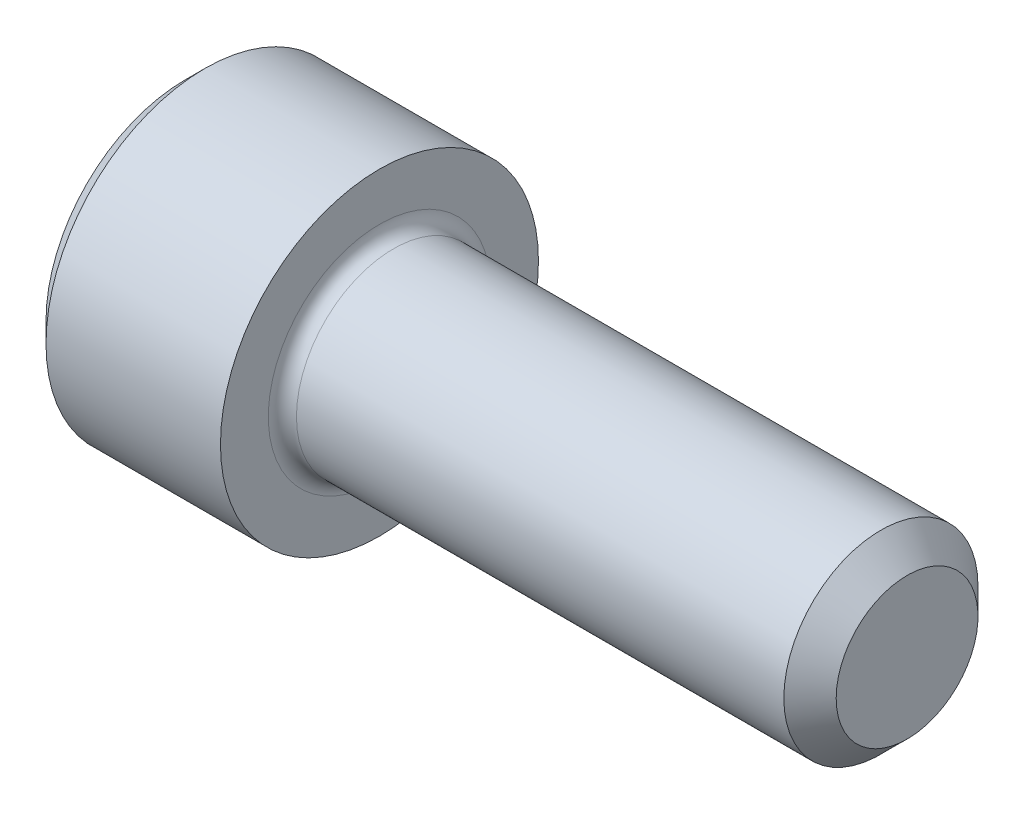
ISO-10303-21;
HEADER;
FILE_DESCRIPTION(('STEP AP214'),'2;1');
FILE_NAME('part.step','',(''),(''),'','','');
FILE_SCHEMA(('AUTOMOTIVE_DESIGN { 1 0 10303 214 1 1 1 1 }'));
ENDSEC;
DATA;
#1=APPLICATION_CONTEXT('core data for automotive mechanical design processes');
#2=APPLICATION_PROTOCOL_DEFINITION('international standard','automotive_design',2000,#1);
#3=PRODUCT_CONTEXT('',#1,'mechanical');
#4=PRODUCT('Part','Part','',(#3));
#5=PRODUCT_RELATED_PRODUCT_CATEGORY('part','',(#4));
#6=PRODUCT_DEFINITION_FORMATION('','',#4);
#7=PRODUCT_DEFINITION_CONTEXT('part definition',#1,'design');
#8=PRODUCT_DEFINITION('design','',#6,#7);
#9=PRODUCT_DEFINITION_SHAPE('','',#8);
#10=(LENGTH_UNIT() NAMED_UNIT(*) SI_UNIT(.MILLI.,.METRE.));
#11=(NAMED_UNIT(*) PLANE_ANGLE_UNIT() SI_UNIT($,.RADIAN.));
#12=(NAMED_UNIT(*) SI_UNIT($,.STERADIAN.) SOLID_ANGLE_UNIT());
#13=UNCERTAINTY_MEASURE_WITH_UNIT(LENGTH_MEASURE(1.E-05),#10,'distance_accuracy_value','');
#14=(GEOMETRIC_REPRESENTATION_CONTEXT(3) GLOBAL_UNCERTAINTY_ASSIGNED_CONTEXT((#13)) GLOBAL_UNIT_ASSIGNED_CONTEXT((#10,
#11,#12)) REPRESENTATION_CONTEXT('',''));
#15=CARTESIAN_POINT('',(0.,0.,0.));
#16=DIRECTION('',(0.,0.,1.));
#17=DIRECTION('',(1.,0.,0.));
#18=AXIS2_PLACEMENT_3D('',#15,#16,#17);
#19=CARTESIAN_POINT('',(0.,0.,0.));
#20=DIRECTION('',(-1.,0.,0.));
#21=DIRECTION('',(0.,0.,1.));
#22=AXIS2_PLACEMENT_3D('',#19,#20,#21);
#23=PLANE('',#22);
#24=DIRECTION('',(0.,-0.499999999999998,0.86602540378444));
#25=VECTOR('',#24,1.);
#26=CARTESIAN_POINT('',(0.,1.5984519552784,0.));
#27=LINE('',#26,#25);
#28=CARTESIAN_POINT('',(0.,1.5984519552784,0.));
#29=VERTEX_POINT('',#28);
#30=CARTESIAN_POINT('',(0.,0.799225977639206,1.3843));
#31=VERTEX_POINT('',#30);
#32=EDGE_CURVE('E376',#29,#31,#27,.T.);
#33=ORIENTED_EDGE('',*,*,#32,.T.);
#34=DIRECTION('',(0.,1.,0.));
#35=VECTOR('',#34,1.);
#36=CARTESIAN_POINT('',(0.,-0.799225977639191,1.3843));
#37=LINE('',#36,#35);
#38=CARTESIAN_POINT('',(0.,-0.799225977639191,1.3843));
#39=VERTEX_POINT('',#38);
#40=EDGE_CURVE('E124',#39,#31,#37,.T.);
#41=ORIENTED_EDGE('',*,*,#40,.F.);
#42=DIRECTION('',(0.,-0.500000000000001,-0.866025403784438));
#43=VECTOR('',#42,1.);
#44=CARTESIAN_POINT('',(0.,-0.799225977639191,1.3843));
#45=LINE('',#44,#43);
#46=CARTESIAN_POINT('',(0.,-1.59845195527839,0.));
#47=VERTEX_POINT('',#46);
#48=EDGE_CURVE('E379',#39,#47,#45,.T.);
#49=ORIENTED_EDGE('',*,*,#48,.T.);
#50=DIRECTION('',(0.,0.499999999999998,-0.86602540378444));
#51=VECTOR('',#50,1.);
#52=CARTESIAN_POINT('',(0.,-1.59845195527839,0.));
#53=LINE('',#52,#51);
#54=CARTESIAN_POINT('',(0.,-0.799225977639195,-1.3843));
#55=VERTEX_POINT('',#54);
#56=EDGE_CURVE('E382',#47,#55,#53,.T.);
#57=ORIENTED_EDGE('',*,*,#56,.T.);
#58=DIRECTION('',(0.,-1.,0.));
#59=VECTOR('',#58,1.);
#60=CARTESIAN_POINT('',(0.,0.799225977639201,-1.3843));
#61=LINE('',#60,#59);
#62=CARTESIAN_POINT('',(0.,0.799225977639201,-1.3843));
#63=VERTEX_POINT('',#62);
#64=EDGE_CURVE('E385',#63,#55,#61,.T.);
#65=ORIENTED_EDGE('',*,*,#64,.F.);
#66=DIRECTION('',(0.,-0.500000000000001,-0.866025403784438));
#67=VECTOR('',#66,1.);
#68=CARTESIAN_POINT('',(0.,1.5984519552784,0.));
#69=LINE('',#68,#67);
#70=EDGE_CURVE('E119',#29,#63,#69,.T.);
#71=ORIENTED_EDGE('',*,*,#70,.F.);
#72=EDGE_LOOP('',(#33,#41,#49,#57,#65,#71));
#73=FACE_BOUND('',#72,.T.);
#74=CARTESIAN_POINT('',(0.,0.,0.));
#75=DIRECTION('',(-1.,0.,0.));
#76=DIRECTION('',(0.,0.,1.));
#77=AXIS2_PLACEMENT_3D('',#74,#75,#76);
#78=CIRCLE('',#77,2.5146);
#79=CARTESIAN_POINT('',(0.,0.,2.5146));
#80=VERTEX_POINT('',#79);
#81=EDGE_CURVE('E135',#80,#80,#78,.T.);
#82=ORIENTED_EDGE('',*,*,#81,.T.);
#83=EDGE_LOOP('',(#82));
#84=FACE_BOUND('',#83,.T.);
#85=ADVANCED_FACE('F32',(#73,#84),#23,.T.);
#86=CARTESIAN_POINT('',(13.0302,1.28016,0.));
#87=DIRECTION('',(1.,0.,0.));
#88=DIRECTION('',(0.,0.,-1.));
#89=AXIS2_PLACEMENT_3D('',#86,#87,#88);
#90=PLANE('',#89);
#91=CARTESIAN_POINT('',(13.0302,0.,0.));
#92=DIRECTION('',(-1.,0.,0.));
#93=DIRECTION('',(0.,0.,1.));
#94=AXIS2_PLACEMENT_3D('',#91,#92,#93);
#95=CIRCLE('',#94,1.28016);
#96=CARTESIAN_POINT('',(13.0302,0.,1.28016));
#97=VERTEX_POINT('',#96);
#98=EDGE_CURVE('E148',#97,#97,#95,.T.);
#99=ORIENTED_EDGE('',*,*,#98,.F.);
#100=EDGE_LOOP('',(#99));
#101=FACE_BOUND('',#100,.T.);
#102=ADVANCED_FACE('F169',(#101),#90,.T.);
#103=CARTESIAN_POINT('',(13.0302,0.,0.));
#104=DIRECTION('',(-1.,0.,0.));
#105=DIRECTION('',(0.,0.,1.));
#106=AXIS2_PLACEMENT_3D('',#103,#104,#105);
#107=CONICAL_SURFACE('',#106,1.28016,0.78539816339727);
#108=CARTESIAN_POINT('',(12.5577599999999,0.,0.));
#109=DIRECTION('',(-1.,0.,0.));
#110=DIRECTION('',(0.,0.,1.));
#111=AXIS2_PLACEMENT_3D('',#108,#109,#110);
#112=CIRCLE('',#111,1.75259999999991);
#113=CARTESIAN_POINT('',(12.5577599999999,0.,1.75259999999991));
#114=VERTEX_POINT('',#113);
#115=EDGE_CURVE('E145',#114,#114,#112,.T.);
#116=ORIENTED_EDGE('',*,*,#115,.F.);
#117=EDGE_LOOP('',(#116));
#118=FACE_BOUND('',#117,.T.);
#119=ORIENTED_EDGE('',*,*,#98,.T.);
#120=EDGE_LOOP('',(#119));
#121=FACE_BOUND('',#120,.T.);
#122=ADVANCED_FACE('F175',(#118,#121),#107,.T.);
#123=CARTESIAN_POINT('',(-31.75,0.,0.));
#124=DIRECTION('',(-1.,0.,0.));
#125=DIRECTION('',(0.,0.,1.));
#126=AXIS2_PLACEMENT_3D('',#123,#124,#125);
#127=CYLINDRICAL_SURFACE('',#126,1.75259999999995);
#128=CARTESIAN_POINT('',(3.7592,0.,0.));
#129=DIRECTION('',(1.,0.,0.));
#130=DIRECTION('',(0.,0.,-1.));
#131=AXIS2_PLACEMENT_3D('',#128,#129,#130);
#132=CIRCLE('',#131,1.75259999999995);
#133=CARTESIAN_POINT('',(3.7592,0.,-1.75259999999995));
#134=VERTEX_POINT('',#133);
#135=EDGE_CURVE('E11',#134,#134,#132,.T.);
#136=ORIENTED_EDGE('',*,*,#135,.T.);
#137=EDGE_LOOP('',(#136));
#138=FACE_BOUND('',#137,.T.);
#139=ORIENTED_EDGE('',*,*,#115,.T.);
#140=EDGE_LOOP('',(#139));
#141=FACE_BOUND('',#140,.T.);
#142=ADVANCED_FACE('F186',(#138,#141),#127,.T.);
#143=CARTESIAN_POINT('',(3.5052,2.8702,0.));
#144=DIRECTION('',(1.,0.,0.));
#145=DIRECTION('',(0.,0.,-1.));
#146=AXIS2_PLACEMENT_3D('',#143,#144,#145);
#147=PLANE('',#146);
#148=CARTESIAN_POINT('',(3.5052,0.,0.));
#149=DIRECTION('',(1.,0.,0.));
#150=DIRECTION('',(0.,0.,-1.));
#151=AXIS2_PLACEMENT_3D('',#148,#149,#150);
#152=CIRCLE('',#151,2.00659999999995);
#153=CARTESIAN_POINT('',(3.5052,0.,-2.00659999999995));
#154=VERTEX_POINT('',#153);
#155=EDGE_CURVE('E40',#154,#154,#152,.F.);
#156=ORIENTED_EDGE('',*,*,#155,.T.);
#157=EDGE_LOOP('',(#156));
#158=FACE_BOUND('',#157,.T.);
#159=CARTESIAN_POINT('',(3.5052,0.,0.));
#160=DIRECTION('',(-1.,0.,0.));
#161=DIRECTION('',(0.,0.,1.));
#162=AXIS2_PLACEMENT_3D('',#159,#160,#161);
#163=CIRCLE('',#162,2.8702);
#164=CARTESIAN_POINT('',(3.5052,0.,2.8702));
#165=VERTEX_POINT('',#164);
#166=EDGE_CURVE('E142',#165,#165,#163,.T.);
#167=ORIENTED_EDGE('',*,*,#166,.F.);
#168=EDGE_LOOP('',(#167));
#169=FACE_BOUND('',#168,.T.);
#170=ADVANCED_FACE('F153',(#158,#169),#147,.T.);
#171=CARTESIAN_POINT('',(-31.75,0.,0.));
#172=DIRECTION('',(-1.,0.,0.));
#173=DIRECTION('',(0.,0.,1.));
#174=AXIS2_PLACEMENT_3D('',#171,#172,#173);
#175=CYLINDRICAL_SURFACE('',#174,2.8702);
#176=ORIENTED_EDGE('',*,*,#166,.T.);
#177=EDGE_LOOP('',(#176));
#178=FACE_BOUND('',#177,.T.);
#179=CARTESIAN_POINT('',(0.355599999999998,0.,0.));
#180=DIRECTION('',(-1.,0.,0.));
#181=DIRECTION('',(0.,0.,1.));
#182=AXIS2_PLACEMENT_3D('',#179,#180,#181);
#183=CIRCLE('',#182,2.8702);
#184=CARTESIAN_POINT('',(0.355599999999998,0.,2.8702));
#185=VERTEX_POINT('',#184);
#186=EDGE_CURVE('E139',#185,#185,#183,.T.);
#187=ORIENTED_EDGE('',*,*,#186,.F.);
#188=EDGE_LOOP('',(#187));
#189=FACE_BOUND('',#188,.T.);
#190=ADVANCED_FACE('F164',(#178,#189),#175,.T.);
#191=CARTESIAN_POINT('',(0.,0.,0.));
#192=DIRECTION('',(1.,0.,0.));
#193=DIRECTION('',(0.,0.,-1.));
#194=AXIS2_PLACEMENT_3D('',#191,#192,#193);
#195=CONICAL_SURFACE('',#194,2.5146,0.785398163397451);
#196=ORIENTED_EDGE('',*,*,#186,.T.);
#197=EDGE_LOOP('',(#196));
#198=FACE_BOUND('',#197,.T.);
#199=ORIENTED_EDGE('',*,*,#81,.F.);
#200=EDGE_LOOP('',(#199));
#201=FACE_BOUND('',#200,.T.);
#202=ADVANCED_FACE('F157',(#198,#201),#195,.T.);
#203=CARTESIAN_POINT('',(3.7592,0.,0.));
#204=DIRECTION('',(1.,0.,0.));
#205=DIRECTION('',(0.,0.,-1.));
#206=AXIS2_PLACEMENT_3D('',#203,#204,#205);
#207=TOROIDAL_SURFACE('',#206,2.00659999999995,0.254);
#208=ORIENTED_EDGE('',*,*,#135,.F.);
#209=EDGE_LOOP('',(#208));
#210=FACE_BOUND('',#209,.T.);
#211=ORIENTED_EDGE('',*,*,#155,.F.);
#212=EDGE_LOOP('',(#211));
#213=FACE_BOUND('',#212,.T.);
#214=ADVANCED_FACE('F34',(#210,#213),#207,.F.);
#215=CARTESIAN_POINT('',(1.6256,1.5984519552784,0.));
#216=DIRECTION('',(0.,-0.86602540378444,-0.499999999999998));
#217=DIRECTION('',(0.,0.499999999999998,-0.86602540378444));
#218=AXIS2_PLACEMENT_3D('',#215,#216,#217);
#219=PLANE('',#218);
#220=ORIENTED_EDGE('',*,*,#32,.F.);
#221=DIRECTION('',(-1.,0.,0.));
#222=VECTOR('',#221,1.);
#223=CARTESIAN_POINT('',(1.6256,1.5984519552784,0.));
#224=LINE('',#223,#222);
#225=CARTESIAN_POINT('',(1.6256,1.5984519552784,0.));
#226=VERTEX_POINT('',#225);
#227=EDGE_CURVE('E375',#226,#29,#224,.T.);
#228=ORIENTED_EDGE('',*,*,#227,.F.);
#229=DIRECTION('',(0.,-0.499999999999998,0.86602540378444));
#230=VECTOR('',#229,1.);
#231=CARTESIAN_POINT('',(1.6256,1.5984519552784,0.));
#232=LINE('',#231,#230);
#233=CARTESIAN_POINT('',(1.6256,1.1988389664588,0.692149999999997));
#234=VERTEX_POINT('',#233);
#235=EDGE_CURVE('E47',#226,#234,#232,.T.);
#236=ORIENTED_EDGE('',*,*,#235,.T.);
#237=CARTESIAN_POINT('',(1.6256,0.799225977639206,1.3843));
#238=VERTEX_POINT('',#237);
#239=EDGE_CURVE('E105',#234,#238,#232,.T.);
#240=ORIENTED_EDGE('',*,*,#239,.T.);
#241=DIRECTION('',(-1.,0.,0.));
#242=VECTOR('',#241,1.);
#243=CARTESIAN_POINT('',(1.6256,0.799225977639206,1.3843));
#244=LINE('',#243,#242);
#245=EDGE_CURVE('E117',#238,#31,#244,.T.);
#246=ORIENTED_EDGE('',*,*,#245,.T.);
#247=EDGE_LOOP('',(#220,#228,#236,#240,#246));
#248=FACE_BOUND('',#247,.T.);
#249=ADVANCED_FACE('F116',(#248),#219,.T.);
#250=CARTESIAN_POINT('',(1.6256,-0.799225977639191,1.3843));
#251=DIRECTION('',(0.,0.,1.));
#252=DIRECTION('',(0.,-1.,0.));
#253=AXIS2_PLACEMENT_3D('',#250,#251,#252);
#254=PLANE('',#253);
#255=ORIENTED_EDGE('',*,*,#40,.T.);
#256=ORIENTED_EDGE('',*,*,#245,.F.);
#257=DIRECTION('',(0.,1.,0.));
#258=VECTOR('',#257,1.);
#259=CARTESIAN_POINT('',(1.6256,-0.799225977639191,1.3843));
#260=LINE('',#259,#258);
#261=CARTESIAN_POINT('',(1.6256,0.,1.3843));
#262=VERTEX_POINT('',#261);
#263=EDGE_CURVE('E103',#262,#238,#260,.T.);
#264=ORIENTED_EDGE('',*,*,#263,.F.);
#265=CARTESIAN_POINT('',(1.6256,-0.799225977639191,1.3843));
#266=VERTEX_POINT('',#265);
#267=EDGE_CURVE('E113',#266,#262,#260,.T.);
#268=ORIENTED_EDGE('',*,*,#267,.F.);
#269=DIRECTION('',(-1.,0.,0.));
#270=VECTOR('',#269,1.);
#271=CARTESIAN_POINT('',(1.6256,-0.799225977639191,1.3843));
#272=LINE('',#271,#270);
#273=EDGE_CURVE('E126',#266,#39,#272,.T.);
#274=ORIENTED_EDGE('',*,*,#273,.T.);
#275=EDGE_LOOP('',(#255,#256,#264,#268,#274));
#276=FACE_BOUND('',#275,.T.);
#277=ADVANCED_FACE('F121',(#276),#254,.F.);
#278=CARTESIAN_POINT('',(1.6256,-0.799225977639191,1.3843));
#279=DIRECTION('',(0.,0.866025403784438,-0.500000000000001));
#280=DIRECTION('',(0.,0.500000000000001,0.866025403784438));
#281=AXIS2_PLACEMENT_3D('',#278,#279,#280);
#282=PLANE('',#281);
#283=ORIENTED_EDGE('',*,*,#48,.F.);
#284=ORIENTED_EDGE('',*,*,#273,.F.);
#285=DIRECTION('',(0.,-0.500000000000001,-0.866025403784438));
#286=VECTOR('',#285,1.);
#287=CARTESIAN_POINT('',(1.6256,-0.799225977639191,1.3843));
#288=LINE('',#287,#286);
#289=CARTESIAN_POINT('',(1.6256,-1.19883896645879,0.692149999999998));
#290=VERTEX_POINT('',#289);
#291=EDGE_CURVE('E356',#266,#290,#288,.T.);
#292=ORIENTED_EDGE('',*,*,#291,.T.);
#293=CARTESIAN_POINT('',(1.6256,-1.59845195527839,0.));
#294=VERTEX_POINT('',#293);
#295=EDGE_CURVE('E358',#290,#294,#288,.T.);
#296=ORIENTED_EDGE('',*,*,#295,.T.);
#297=DIRECTION('',(-1.,0.,0.));
#298=VECTOR('',#297,1.);
#299=CARTESIAN_POINT('',(1.6256,-1.59845195527839,0.));
#300=LINE('',#299,#298);
#301=EDGE_CURVE('E131',#294,#47,#300,.T.);
#302=ORIENTED_EDGE('',*,*,#301,.T.);
#303=EDGE_LOOP('',(#283,#284,#292,#296,#302));
#304=FACE_BOUND('',#303,.T.);
#305=ADVANCED_FACE('F248',(#304),#282,.T.);
#306=CARTESIAN_POINT('',(1.6256,-1.59845195527839,0.));
#307=DIRECTION('',(0.,0.866025403784439,0.499999999999998));
#308=DIRECTION('',(0.,-0.499999999999999,0.86602540378444));
#309=AXIS2_PLACEMENT_3D('',#306,#307,#308);
#310=PLANE('',#309);
#311=ORIENTED_EDGE('',*,*,#56,.F.);
#312=ORIENTED_EDGE('',*,*,#301,.F.);
#313=DIRECTION('',(0.,0.499999999999998,-0.86602540378444));
#314=VECTOR('',#313,1.);
#315=CARTESIAN_POINT('',(1.6256,-1.59845195527839,0.));
#316=LINE('',#315,#314);
#317=CARTESIAN_POINT('',(1.6256,-1.1988389664588,-0.692149999999996));
#318=VERTEX_POINT('',#317);
#319=EDGE_CURVE('E361',#294,#318,#316,.T.);
#320=ORIENTED_EDGE('',*,*,#319,.T.);
#321=CARTESIAN_POINT('',(1.6256,-0.799225977639195,-1.3843));
#322=VERTEX_POINT('',#321);
#323=EDGE_CURVE('E365',#318,#322,#316,.T.);
#324=ORIENTED_EDGE('',*,*,#323,.T.);
#325=DIRECTION('',(-1.,0.,0.));
#326=VECTOR('',#325,1.);
#327=CARTESIAN_POINT('',(1.6256,-0.799225977639195,-1.3843));
#328=LINE('',#327,#326);
#329=EDGE_CURVE('E394',#322,#55,#328,.T.);
#330=ORIENTED_EDGE('',*,*,#329,.T.);
#331=EDGE_LOOP('',(#311,#312,#320,#324,#330));
#332=FACE_BOUND('',#331,.T.);
#333=ADVANCED_FACE('F256',(#332),#310,.T.);
#334=CARTESIAN_POINT('',(1.6256,0.799225977639201,-1.3843));
#335=DIRECTION('',(0.,0.,-1.));
#336=DIRECTION('',(0.,1.,0.));
#337=AXIS2_PLACEMENT_3D('',#334,#335,#336);
#338=PLANE('',#337);
#339=ORIENTED_EDGE('',*,*,#64,.T.);
#340=ORIENTED_EDGE('',*,*,#329,.F.);
#341=DIRECTION('',(0.,-1.,0.));
#342=VECTOR('',#341,1.);
#343=CARTESIAN_POINT('',(1.6256,0.799225977639201,-1.3843));
#344=LINE('',#343,#342);
#345=CARTESIAN_POINT('',(1.6256,0.,-1.3843));
#346=VERTEX_POINT('',#345);
#347=EDGE_CURVE('E369',#346,#322,#344,.T.);
#348=ORIENTED_EDGE('',*,*,#347,.F.);
#349=CARTESIAN_POINT('',(1.6256,0.799225977639201,-1.3843));
#350=VERTEX_POINT('',#349);
#351=EDGE_CURVE('E370',#350,#346,#344,.T.);
#352=ORIENTED_EDGE('',*,*,#351,.F.);
#353=DIRECTION('',(-1.,0.,0.));
#354=VECTOR('',#353,1.);
#355=CARTESIAN_POINT('',(1.6256,0.799225977639201,-1.3843));
#356=LINE('',#355,#354);
#357=EDGE_CURVE('E391',#350,#63,#356,.T.);
#358=ORIENTED_EDGE('',*,*,#357,.T.);
#359=EDGE_LOOP('',(#339,#340,#348,#352,#358));
#360=FACE_BOUND('',#359,.T.);
#361=ADVANCED_FACE('F265',(#360),#338,.F.);
#362=CARTESIAN_POINT('',(1.6256,1.5984519552784,0.));
#363=DIRECTION('',(0.,0.866025403784438,-0.500000000000001));
#364=DIRECTION('',(0.,0.500000000000001,0.866025403784438));
#365=AXIS2_PLACEMENT_3D('',#362,#363,#364);
#366=PLANE('',#365);
#367=ORIENTED_EDGE('',*,*,#70,.T.);
#368=ORIENTED_EDGE('',*,*,#357,.F.);
#369=DIRECTION('',(0.,-0.500000000000001,-0.866025403784438));
#370=VECTOR('',#369,1.);
#371=CARTESIAN_POINT('',(1.6256,1.5984519552784,0.));
#372=LINE('',#371,#370);
#373=CARTESIAN_POINT('',(1.6256,1.1988389664588,-0.692150000000004));
#374=VERTEX_POINT('',#373);
#375=EDGE_CURVE('E373',#374,#350,#372,.T.);
#376=ORIENTED_EDGE('',*,*,#375,.F.);
#377=EDGE_CURVE('E347',#226,#374,#372,.T.);
#378=ORIENTED_EDGE('',*,*,#377,.F.);
#379=ORIENTED_EDGE('',*,*,#227,.T.);
#380=EDGE_LOOP('',(#367,#368,#376,#378,#379));
#381=FACE_BOUND('',#380,.T.);
#382=ADVANCED_FACE('F274',(#381),#366,.F.);
#383=CARTESIAN_POINT('',(1.6256,0.799225977639206,1.3843));
#384=DIRECTION('',(-1.,0.,0.));
#385=DIRECTION('',(0.,0.,1.));
#386=AXIS2_PLACEMENT_3D('',#383,#384,#385);
#387=PLANE('',#386);
#388=CARTESIAN_POINT('',(1.6256,0.,0.));
#389=DIRECTION('',(-1.,0.,0.));
#390=DIRECTION('',(0.,0.,1.));
#391=AXIS2_PLACEMENT_3D('',#388,#389,#390);
#392=CIRCLE('',#391,1.3843);
#393=EDGE_CURVE('E125',#290,#262,#392,.T.);
#394=ORIENTED_EDGE('',*,*,#393,.F.);
#395=ORIENTED_EDGE('',*,*,#291,.F.);
#396=ORIENTED_EDGE('',*,*,#267,.T.);
#397=EDGE_LOOP('',(#394,#395,#396));
#398=FACE_BOUND('',#397,.T.);
#399=ADVANCED_FACE('F283',(#398),#387,.T.);
#400=EDGE_CURVE('E129',#318,#290,#392,.T.);
#401=ORIENTED_EDGE('',*,*,#400,.F.);
#402=ORIENTED_EDGE('',*,*,#319,.F.);
#403=ORIENTED_EDGE('',*,*,#295,.F.);
#404=EDGE_LOOP('',(#401,#402,#403));
#405=FACE_BOUND('',#404,.T.);
#406=ADVANCED_FACE('F292',(#405),#387,.T.);
#407=EDGE_CURVE('E400',#346,#318,#392,.T.);
#408=ORIENTED_EDGE('',*,*,#407,.F.);
#409=ORIENTED_EDGE('',*,*,#347,.T.);
#410=ORIENTED_EDGE('',*,*,#323,.F.);
#411=EDGE_LOOP('',(#408,#409,#410));
#412=FACE_BOUND('',#411,.T.);
#413=ADVANCED_FACE('F301',(#412),#387,.T.);
#414=EDGE_CURVE('E350',#374,#346,#392,.T.);
#415=ORIENTED_EDGE('',*,*,#414,.F.);
#416=ORIENTED_EDGE('',*,*,#375,.T.);
#417=ORIENTED_EDGE('',*,*,#351,.T.);
#418=EDGE_LOOP('',(#415,#416,#417));
#419=FACE_BOUND('',#418,.T.);
#420=ADVANCED_FACE('F309',(#419),#387,.T.);
#421=EDGE_CURVE('E136',#234,#374,#392,.T.);
#422=ORIENTED_EDGE('',*,*,#421,.F.);
#423=ORIENTED_EDGE('',*,*,#235,.F.);
#424=ORIENTED_EDGE('',*,*,#377,.T.);
#425=EDGE_LOOP('',(#422,#423,#424));
#426=FACE_BOUND('',#425,.T.);
#427=ADVANCED_FACE('F317',(#426),#387,.T.);
#428=EDGE_CURVE('E108',#262,#234,#392,.T.);
#429=ORIENTED_EDGE('',*,*,#428,.F.);
#430=ORIENTED_EDGE('',*,*,#263,.T.);
#431=ORIENTED_EDGE('',*,*,#239,.F.);
#432=EDGE_LOOP('',(#429,#430,#431));
#433=FACE_BOUND('',#432,.T.);
#434=ADVANCED_FACE('F104',(#433),#387,.T.);
#435=CARTESIAN_POINT('',(1.6256,0.,0.));
#436=DIRECTION('',(-1.,0.,0.));
#437=DIRECTION('',(0.,0.,1.));
#438=AXIS2_PLACEMENT_3D('',#435,#436,#437);
#439=CONICAL_SURFACE('',#438,1.3843,1.04719755119659);
#440=CARTESIAN_POINT('',(2.4248259776392,0.,0.));
#441=VERTEX_POINT('',#440);
#442=VERTEX_LOOP('',#441);
#443=FACE_BOUND('',#442,.T.);
#444=ORIENTED_EDGE('',*,*,#428,.T.);
#445=ORIENTED_EDGE('',*,*,#421,.T.);
#446=ORIENTED_EDGE('',*,*,#414,.T.);
#447=ORIENTED_EDGE('',*,*,#407,.T.);
#448=ORIENTED_EDGE('',*,*,#400,.T.);
#449=ORIENTED_EDGE('',*,*,#393,.T.);
#450=EDGE_LOOP('',(#444,#445,#446,#447,#448,#449));
#451=FACE_BOUND('',#450,.T.);
#452=ADVANCED_FACE('F179',(#443,#451),#439,.F.);
#453=CLOSED_SHELL('',(#85,#102,#122,#142,#170,#190,#202,#214,#249,#277,#305,#333,#361,#382,#399,
#406,#413,#420,#427,#434,#452));
#454=MANIFOLD_SOLID_BREP('B2',#453);
#455=ADVANCED_BREP_SHAPE_REPRESENTATION('',(#18,#454),#14);
#456=SHAPE_DEFINITION_REPRESENTATION(#9,#455);
ENDSEC;
END-ISO-10303-21;
